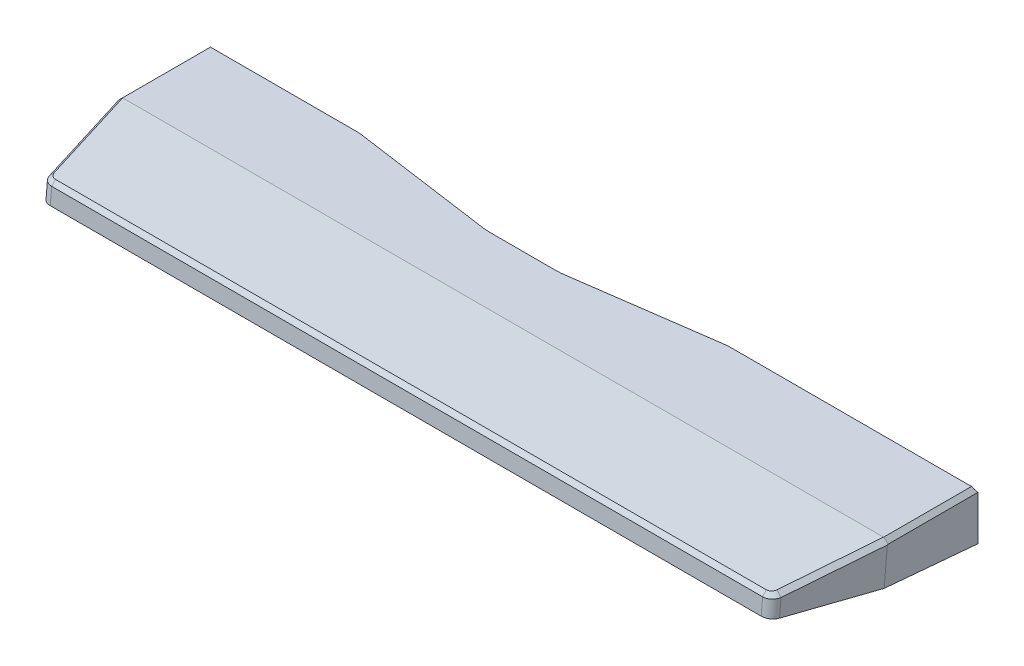
ISO-10303-21;
HEADER;
FILE_DESCRIPTION(('STEP AP214'),'2;1');
FILE_NAME('part.step','',(''),(''),'','','');
FILE_SCHEMA(('AUTOMOTIVE_DESIGN { 1 0 10303 214 1 1 1 1 }'));
ENDSEC;
DATA;
#1=APPLICATION_CONTEXT('core data for automotive mechanical design processes');
#2=APPLICATION_PROTOCOL_DEFINITION('international standard','automotive_design',2000,#1);
#3=PRODUCT_CONTEXT('',#1,'mechanical');
#4=PRODUCT('Part','Part','',(#3));
#5=PRODUCT_RELATED_PRODUCT_CATEGORY('part','',(#4));
#6=PRODUCT_DEFINITION_FORMATION('','',#4);
#7=PRODUCT_DEFINITION_CONTEXT('part definition',#1,'design');
#8=PRODUCT_DEFINITION('design','',#6,#7);
#9=PRODUCT_DEFINITION_SHAPE('','',#8);
#10=(LENGTH_UNIT() NAMED_UNIT(*) SI_UNIT(.MILLI.,.METRE.));
#11=(NAMED_UNIT(*) PLANE_ANGLE_UNIT() SI_UNIT($,.RADIAN.));
#12=(NAMED_UNIT(*) SI_UNIT($,.STERADIAN.) SOLID_ANGLE_UNIT());
#13=UNCERTAINTY_MEASURE_WITH_UNIT(LENGTH_MEASURE(1.E-05),#10,'distance_accuracy_value','');
#14=(GEOMETRIC_REPRESENTATION_CONTEXT(3) GLOBAL_UNCERTAINTY_ASSIGNED_CONTEXT((#13)) GLOBAL_UNIT_ASSIGNED_CONTEXT((#10,
#11,#12)) REPRESENTATION_CONTEXT('',''));
#15=CARTESIAN_POINT('',(0.,0.,0.));
#16=DIRECTION('',(0.,0.,1.));
#17=DIRECTION('',(1.,0.,0.));
#18=AXIS2_PLACEMENT_3D('',#15,#16,#17);
#19=CARTESIAN_POINT('',(348.213934060173,-392.518773560111,105.931813114433));
#20=DIRECTION('',(1.,0.,0.));
#21=DIRECTION('',(0.,0.,-1.));
#22=AXIS2_PLACEMENT_3D('',#19,#20,#21);
#23=PLANE('',#22);
#24=DIRECTION('',(0.,1.,0.));
#25=VECTOR('',#24,1.);
#26=CARTESIAN_POINT('',(348.213934060173,-392.518773560111,17.3508636292026));
#27=LINE('',#26,#25);
#28=CARTESIAN_POINT('',(348.213934060173,-16.3382244657723,17.3508636292026));
#29=VERTEX_POINT('',#28);
#30=CARTESIAN_POINT('',(348.213934060173,5.00000000000006,17.3508636292026));
#31=VERTEX_POINT('',#30);
#32=EDGE_CURVE('E273',#29,#31,#27,.T.);
#33=ORIENTED_EDGE('',*,*,#32,.T.);
#34=DIRECTION('',(0.,0.,1.));
#35=VECTOR('',#34,1.);
#36=CARTESIAN_POINT('',(348.213934060173,5.00000000000006,105.931813114433));
#37=LINE('',#36,#35);
#38=CARTESIAN_POINT('',(348.213934060173,5.00000000000006,60.4095629339724));
#39=VERTEX_POINT('',#38);
#40=EDGE_CURVE('E566',#31,#39,#37,.T.);
#41=ORIENTED_EDGE('',*,*,#40,.T.);
#42=DIRECTION('',(0.,-0.331657517635309,0.943399857428432));
#43=VECTOR('',#42,1.);
#44=CARTESIAN_POINT('',(348.213934060173,-52.9690159169842,225.302437189531));
#45=LINE('',#44,#43);
#46=CARTESIAN_POINT('',(348.213934060173,4.86005218566501,60.8076445123202));
#47=VERTEX_POINT('',#46);
#48=EDGE_CURVE('E567',#39,#47,#45,.T.);
#49=ORIENTED_EDGE('',*,*,#48,.T.);
#50=DIRECTION('',(0.,-0.996194698091746,0.0871557427476516));
#51=VECTOR('',#50,1.);
#52=CARTESIAN_POINT('',(348.213934060173,10.7568400959438,60.2917424189542));
#53=LINE('',#52,#51);
#54=CARTESIAN_POINT('',(348.213934060173,-12.4041043346582,62.3180624931856));
#55=VERTEX_POINT('',#54);
#56=EDGE_CURVE('E222',#47,#55,#53,.T.);
#57=ORIENTED_EDGE('',*,*,#56,.T.);
#58=DIRECTION('',(0.,0.0871557427476516,0.996194698091746));
#59=VECTOR('',#58,1.);
#60=CARTESIAN_POINT('',(348.213934060173,-11.5047781456363,72.5974078709506));
#61=LINE('',#60,#59);
#62=EDGE_CURVE('E228',#29,#55,#61,.T.);
#63=ORIENTED_EDGE('',*,*,#62,.F.);
#64=EDGE_LOOP('',(#33,#41,#49,#57,#63));
#65=FACE_BOUND('',#64,.T.);
#66=ADVANCED_FACE('F35',(#65),#23,.T.);
#67=CARTESIAN_POINT('',(345.213934060173,7.,13.9967616629529));
#68=DIRECTION('',(0.,1.,0.));
#69=DIRECTION('',(0.,0.,1.));
#70=AXIS2_PLACEMENT_3D('',#67,#68,#69);
#71=PLANE('',#70);
#72=CARTESIAN_POINT('',(-17.6293956239181,7.,13.996761662953));
#73=DIRECTION('',(0.,-1.,0.));
#74=DIRECTION('',(0.,0.,1.));
#75=AXIS2_PLACEMENT_3D('',#72,#73,#74);
#76=CIRCLE('',#75,4.5);
#77=CARTESIAN_POINT('',(-17.6293956239181,7.,18.496761662953));
#78=VERTEX_POINT('',#77);
#79=CARTESIAN_POINT('',(-18.6293956239181,7.,18.384243856649));
#80=VERTEX_POINT('',#79);
#81=EDGE_CURVE('E269',#78,#80,#76,.T.);
#82=ORIENTED_EDGE('',*,*,#81,.T.);
#83=DIRECTION('',(0.,0.,1.));
#84=VECTOR('',#83,1.);
#85=CARTESIAN_POINT('',(-18.6293956239181,7.,13.9967616629529));
#86=LINE('',#85,#84);
#87=CARTESIAN_POINT('',(-18.6293956239181,7.,60.4870163306573));
#88=VERTEX_POINT('',#87);
#89=EDGE_CURVE('E590',#80,#88,#86,.T.);
#90=ORIENTED_EDGE('',*,*,#89,.T.);
#91=DIRECTION('',(-0.327684023558453,0.,-0.944787373277471));
#92=VECTOR('',#91,1.);
#93=CARTESIAN_POINT('',(6.04594556714266,6.99999999999999,131.63162245293));
#94=LINE('',#93,#92);
#95=CARTESIAN_POINT('',(-18.5831255887939,7.,60.6204233380291));
#96=VERTEX_POINT('',#95);
#97=EDGE_CURVE('E588',#88,#96,#94,.F.);
#98=ORIENTED_EDGE('',*,*,#97,.T.);
#99=DIRECTION('',(1.,0.,0.));
#100=VECTOR('',#99,1.);
#101=CARTESIAN_POINT('',(-20.6293956239181,7.,60.6204233380291));
#102=LINE('',#101,#100);
#103=CARTESIAN_POINT('',(346.167664025048,7.,60.6204233380289));
#104=VERTEX_POINT('',#103);
#105=EDGE_CURVE('E626',#96,#104,#102,.T.);
#106=ORIENTED_EDGE('',*,*,#105,.T.);
#107=DIRECTION('',(0.327684023558458,0.,-0.944787373277469));
#108=VECTOR('',#107,1.);
#109=CARTESIAN_POINT('',(360.499555513162,7.,19.2983290652897));
#110=LINE('',#109,#108);
#111=CARTESIAN_POINT('',(346.213934060173,7.,60.4870163306568));
#112=VERTEX_POINT('',#111);
#113=EDGE_CURVE('E579',#104,#112,#110,.T.);
#114=ORIENTED_EDGE('',*,*,#113,.T.);
#115=DIRECTION('',(0.,0.,-1.));
#116=VECTOR('',#115,1.);
#117=CARTESIAN_POINT('',(346.213934060173,7.,13.9967616629529));
#118=LINE('',#117,#116);
#119=CARTESIAN_POINT('',(346.213934060173,7.,18.384243856649));
#120=VERTEX_POINT('',#119);
#121=EDGE_CURVE('E564',#112,#120,#118,.T.);
#122=ORIENTED_EDGE('',*,*,#121,.T.);
#123=CARTESIAN_POINT('',(345.213934060173,7.,13.9967616629529));
#124=DIRECTION('',(0.,-1.,0.));
#125=DIRECTION('',(0.,0.,1.));
#126=AXIS2_PLACEMENT_3D('',#123,#124,#125);
#127=CIRCLE('',#126,4.5);
#128=CARTESIAN_POINT('',(345.213934060173,7.,18.4967616629529));
#129=VERTEX_POINT('',#128);
#130=EDGE_CURVE('E240',#120,#129,#127,.T.);
#131=ORIENTED_EDGE('',*,*,#130,.T.);
#132=DIRECTION('',(-1.,0.,0.));
#133=VECTOR('',#132,1.);
#134=CARTESIAN_POINT('',(345.213934060173,7.,18.4967616629529));
#135=LINE('',#134,#133);
#136=CARTESIAN_POINT('',(231.363868361844,7.,18.4967616629529));
#137=VERTEX_POINT('',#136);
#138=EDGE_CURVE('E242',#129,#137,#135,.T.);
#139=ORIENTED_EDGE('',*,*,#138,.T.);
#140=CARTESIAN_POINT('',(231.363868361844,7.,46.996761662953));
#141=DIRECTION('',(0.,1.,0.));
#142=DIRECTION('',(0.,0.,1.));
#143=AXIS2_PLACEMENT_3D('',#140,#141,#142);
#144=CIRCLE('',#143,28.5);
#145=CARTESIAN_POINT('',(227.397434984482,7.,18.7741217038182));
#146=VERTEX_POINT('',#145);
#147=EDGE_CURVE('E245',#137,#146,#144,.T.);
#148=ORIENTED_EDGE('',*,*,#147,.T.);
#149=DIRECTION('',(-0.990268068741571,0.,0.139173100960059));
#150=VECTOR('',#149,1.);
#151=CARTESIAN_POINT('',(174.579364027522,7.,26.1972174834791));
#152=LINE('',#151,#150);
#153=CARTESIAN_POINT('',(160.860648037282,7.,28.1252572797925));
#154=VERTEX_POINT('',#153);
#155=EDGE_CURVE('E248',#146,#154,#152,.T.);
#156=ORIENTED_EDGE('',*,*,#155,.T.);
#157=CARTESIAN_POINT('',(156.47669535704,7.,-3.06818688556698));
#158=DIRECTION('',(0.,-1.,0.));
#159=DIRECTION('',(0.,0.,1.));
#160=AXIS2_PLACEMENT_3D('',#157,#158,#159);
#161=CIRCLE('',#160,31.5);
#162=CARTESIAN_POINT('',(156.476695357039,7.,28.431813114433));
#163=VERTEX_POINT('',#162);
#164=EDGE_CURVE('E251',#154,#163,#161,.T.);
#165=ORIENTED_EDGE('',*,*,#164,.T.);
#166=DIRECTION('',(-1.,0.,0.));
#167=VECTOR('',#166,1.);
#168=CARTESIAN_POINT('',(156.476695357039,7.,28.431813114433));
#169=LINE('',#168,#167);
#170=CARTESIAN_POINT('',(125.67230407365,7.,28.431813114433));
#171=VERTEX_POINT('',#170);
#172=EDGE_CURVE('E254',#163,#171,#169,.T.);
#173=ORIENTED_EDGE('',*,*,#172,.T.);
#174=CARTESIAN_POINT('',(125.67230407365,7.,-3.06818688556699));
#175=DIRECTION('',(0.,-1.,0.));
#176=DIRECTION('',(0.,0.,1.));
#177=AXIS2_PLACEMENT_3D('',#174,#175,#176);
#178=CIRCLE('',#177,31.5);
#179=CARTESIAN_POINT('',(121.288351393408,7.,28.1252572797925));
#180=VERTEX_POINT('',#179);
#181=EDGE_CURVE('E257',#171,#180,#178,.T.);
#182=ORIENTED_EDGE('',*,*,#181,.T.);
#183=DIRECTION('',(-0.990268068741572,0.,-0.139173100960056));
#184=VECTOR('',#183,1.);
#185=CARTESIAN_POINT('',(121.288351393408,7.,28.1252572797925));
#186=LINE('',#185,#184);
#187=CARTESIAN_POINT('',(54.7515644462058,7.,18.7741217038182));
#188=VERTEX_POINT('',#187);
#189=EDGE_CURVE('E260',#180,#188,#186,.T.);
#190=ORIENTED_EDGE('',*,*,#189,.T.);
#191=CARTESIAN_POINT('',(50.7851310688442,7.,46.996761662953));
#192=DIRECTION('',(0.,1.,0.));
#193=DIRECTION('',(0.,0.,1.));
#194=AXIS2_PLACEMENT_3D('',#191,#192,#193);
#195=CIRCLE('',#194,28.5);
#196=CARTESIAN_POINT('',(50.7851310688441,7.,18.496761662953));
#197=VERTEX_POINT('',#196);
#198=EDGE_CURVE('E263',#188,#197,#195,.T.);
#199=ORIENTED_EDGE('',*,*,#198,.T.);
#200=DIRECTION('',(-1.,0.,0.));
#201=VECTOR('',#200,1.);
#202=CARTESIAN_POINT('',(50.7851310688441,7.,18.496761662953));
#203=LINE('',#202,#201);
#204=EDGE_CURVE('E266',#197,#78,#203,.T.);
#205=ORIENTED_EDGE('',*,*,#204,.T.);
#206=EDGE_LOOP('',(#82,#90,#98,#106,#114,#122,#131,#139,#148,#156,#165,#173,#182,#190,#199,#205));
#207=FACE_BOUND('',#206,.T.);
#208=ADVANCED_FACE('F493',(#207),#71,.T.);
#209=CARTESIAN_POINT('',(0.,-17.7205902201384,1.55035075525035));
#210=DIRECTION('',(0.,0.996194698091746,-0.0871557427476516));
#211=DIRECTION('',(0.,0.0871557427476516,0.996194698091746));
#212=AXIS2_PLACEMENT_3D('',#209,#210,#211);
#213=PLANE('',#212);
#214=DIRECTION('',(-0.216293898799249,0.085092618150326,0.9726130760372));
#215=VECTOR('',#214,1.);
#216=CARTESIAN_POINT('',(344.804994124381,-11.0629864119425,77.6471104939983));
#217=LINE('',#216,#215);
#218=CARTESIAN_POINT('',(339.082037792006,-8.81150664027434,103.381642042776));
#219=VERTEX_POINT('',#218);
#220=EDGE_CURVE('E625',#55,#219,#217,.T.);
#221=ORIENTED_EDGE('',*,*,#220,.T.);
#222=CARTESIAN_POINT('',(334.200396292105,-8.9057629172825,102.304287866709));
#223=DIRECTION('',(0.,0.996194698091746,-0.0871557427476516));
#224=DIRECTION('',(0.,0.0871557427476516,0.996194698091746));
#225=AXIS2_PLACEMENT_3D('',#222,#223,#224);
#226=CIRCLE('',#225,5.);
#227=CARTESIAN_POINT('',(334.200396292105,-8.46998420354422,107.285261357168));
#228=VERTEX_POINT('',#227);
#229=EDGE_CURVE('E580',#219,#228,#226,.F.);
#230=ORIENTED_EDGE('',*,*,#229,.T.);
#231=DIRECTION('',(1.,0.,0.));
#232=VECTOR('',#231,1.);
#233=CARTESIAN_POINT('',(-36.2764368442133,-8.46998420354422,107.285261357168));
#234=LINE('',#233,#232);
#235=CARTESIAN_POINT('',(-6.61585785585053,-8.46998420354422,107.285261357168));
#236=VERTEX_POINT('',#235);
#237=EDGE_CURVE('E212',#236,#228,#234,.T.);
#238=ORIENTED_EDGE('',*,*,#237,.F.);
#239=CARTESIAN_POINT('',(-6.61585785585053,-8.90576291728247,102.30428786671));
#240=DIRECTION('',(0.,0.996194698091746,-0.0871557427476516));
#241=DIRECTION('',(0.,0.0871557427476516,0.996194698091746));
#242=AXIS2_PLACEMENT_3D('',#239,#240,#241);
#243=CIRCLE('',#242,5.);
#244=CARTESIAN_POINT('',(-11.4974993557515,-8.81150664027432,103.381642042777));
#245=VERTEX_POINT('',#244);
#246=EDGE_CURVE('E221',#236,#245,#243,.F.);
#247=ORIENTED_EDGE('',*,*,#246,.T.);
#248=DIRECTION('',(0.216293898799249,0.085092618150326,0.972613076037199));
#249=VECTOR('',#248,1.);
#250=CARTESIAN_POINT('',(-32.5458597444949,-17.0921844735041,8.73306130663646));
#251=LINE('',#250,#249);
#252=CARTESIAN_POINT('',(-20.6293956239181,-12.4041043346582,62.3180624931855));
#253=VERTEX_POINT('',#252);
#254=EDGE_CURVE('E205',#253,#245,#251,.T.);
#255=ORIENTED_EDGE('',*,*,#254,.F.);
#256=DIRECTION('',(0.,-0.0871557427476516,-0.996194698091746));
#257=VECTOR('',#256,1.);
#258=CARTESIAN_POINT('',(-20.6293956239181,-11.5047781456363,72.5974078709506));
#259=LINE('',#258,#257);
#260=CARTESIAN_POINT('',(-20.6293956239181,-16.3382244657723,17.3508636292026));
#261=VERTEX_POINT('',#260);
#262=EDGE_CURVE('E217',#253,#261,#259,.T.);
#263=ORIENTED_EDGE('',*,*,#262,.T.);
#264=CARTESIAN_POINT('',(-17.6293956239181,-16.6316703641291,13.996761662953));
#265=DIRECTION('',(0.,0.996194698091746,-0.0871557427476516));
#266=DIRECTION('',(0.,0.0871557427476516,0.996194698091746));
#267=AXIS2_PLACEMENT_3D('',#264,#265,#266);
#268=ELLIPSE('',#267,4.51718926894506,4.5);
#269=CARTESIAN_POINT('',(-17.6293956239181,-16.2379713782624,18.4967616629529));
#270=VERTEX_POINT('',#269);
#271=EDGE_CURVE('E229',#261,#270,#268,.T.);
#272=ORIENTED_EDGE('',*,*,#271,.T.);
#273=DIRECTION('',(1.,0.,0.));
#274=VECTOR('',#273,1.);
#275=CARTESIAN_POINT('',(50.7851310688441,-16.2379713782624,18.496761662953));
#276=LINE('',#275,#274);
#277=CARTESIAN_POINT('',(50.7851310688441,-16.2379713782625,18.496761662953));
#278=VERTEX_POINT('',#277);
#279=EDGE_CURVE('E234',#270,#278,#276,.T.);
#280=ORIENTED_EDGE('',*,*,#279,.T.);
#281=CARTESIAN_POINT('',(50.7851310688442,-13.7445444677738,46.996761662953));
#282=DIRECTION('',(0.,0.996194698091746,-0.0871557427476516));
#283=DIRECTION('',(0.,0.0871557427476516,0.996194698091746));
#284=AXIS2_PLACEMENT_3D('',#281,#282,#283);
#285=ELLIPSE('',#284,28.6088653699854,28.5);
#286=CARTESIAN_POINT('',(54.7515644462058,-16.2137055189717,18.7741217038182));
#287=VERTEX_POINT('',#286);
#288=EDGE_CURVE('E608',#278,#287,#285,.F.);
#289=ORIENTED_EDGE('',*,*,#288,.T.);
#290=DIRECTION('',(0.99019466999131,0.0121751661105521,0.139162785438428));
#291=VECTOR('',#290,1.);
#292=CARTESIAN_POINT('',(116.741835494738,-15.4514898959966,27.4862861404058));
#293=LINE('',#292,#291);
#294=CARTESIAN_POINT('',(121.288351393408,-15.39558716498,28.1252572797925));
#295=VERTEX_POINT('',#294);
#296=EDGE_CURVE('E609',#287,#295,#293,.T.);
#297=ORIENTED_EDGE('',*,*,#296,.T.);
#298=CARTESIAN_POINT('',(125.67230407365,-18.1246599057777,-3.06818688556699));
#299=DIRECTION('',(0.,0.996194698091746,-0.0871557427476516));
#300=DIRECTION('',(0.,0.0871557427476516,0.996194698091746));
#301=AXIS2_PLACEMENT_3D('',#298,#299,#300);
#302=ELLIPSE('',#301,31.6203248826154,31.5);
#303=CARTESIAN_POINT('',(125.67230407365,-15.3687670047112,28.431813114433));
#304=VERTEX_POINT('',#303);
#305=EDGE_CURVE('E613',#295,#304,#302,.T.);
#306=ORIENTED_EDGE('',*,*,#305,.T.);
#307=DIRECTION('',(1.,0.,0.));
#308=VECTOR('',#307,1.);
#309=CARTESIAN_POINT('',(156.476695357039,-15.3687670047112,28.431813114433));
#310=LINE('',#309,#308);
#311=CARTESIAN_POINT('',(156.476695357039,-15.3687670047112,28.431813114433));
#312=VERTEX_POINT('',#311);
#313=EDGE_CURVE('E615',#304,#312,#310,.T.);
#314=ORIENTED_EDGE('',*,*,#313,.T.);
#315=CARTESIAN_POINT('',(156.47669535704,-18.1246599057777,-3.06818688556698));
#316=DIRECTION('',(0.,0.996194698091746,-0.0871557427476516));
#317=DIRECTION('',(0.,0.0871557427476516,0.996194698091746));
#318=AXIS2_PLACEMENT_3D('',#315,#316,#317);
#319=ELLIPSE('',#318,31.6203248826154,31.5);
#320=CARTESIAN_POINT('',(160.860648037282,-15.39558716498,28.1252572797925));
#321=VERTEX_POINT('',#320);
#322=EDGE_CURVE('E617',#312,#321,#319,.T.);
#323=ORIENTED_EDGE('',*,*,#322,.T.);
#324=DIRECTION('',(0.990194669991309,-0.0121751661105524,-0.139162785438432));
#325=VECTOR('',#324,1.);
#326=CARTESIAN_POINT('',(179.123846336857,-15.6201465165358,25.558532146435));
#327=LINE('',#326,#325);
#328=CARTESIAN_POINT('',(227.397434984482,-16.2137055189717,18.7741217038181));
#329=VERTEX_POINT('',#328);
#330=EDGE_CURVE('E619',#321,#329,#327,.T.);
#331=ORIENTED_EDGE('',*,*,#330,.T.);
#332=CARTESIAN_POINT('',(231.363868361844,-13.7445444677738,46.996761662953));
#333=DIRECTION('',(0.,0.996194698091746,-0.0871557427476516));
#334=DIRECTION('',(0.,0.0871557427476516,0.996194698091746));
#335=AXIS2_PLACEMENT_3D('',#332,#333,#334);
#336=ELLIPSE('',#335,28.6088653699854,28.5);
#337=CARTESIAN_POINT('',(231.363868361844,-16.2379713782624,18.4967616629529));
#338=VERTEX_POINT('',#337);
#339=EDGE_CURVE('E276',#329,#338,#336,.F.);
#340=ORIENTED_EDGE('',*,*,#339,.T.);
#341=DIRECTION('',(1.,0.,0.));
#342=VECTOR('',#341,1.);
#343=CARTESIAN_POINT('',(345.213934060173,-16.2379713782624,18.4967616629529));
#344=LINE('',#343,#342);
#345=CARTESIAN_POINT('',(345.213934060173,-16.2379713782624,18.4967616629529));
#346=VERTEX_POINT('',#345);
#347=EDGE_CURVE('E239',#338,#346,#344,.T.);
#348=ORIENTED_EDGE('',*,*,#347,.T.);
#349=CARTESIAN_POINT('',(345.213934060173,-16.6316703641291,13.9967616629529));
#350=DIRECTION('',(0.,0.996194698091746,-0.0871557427476516));
#351=DIRECTION('',(0.,0.0871557427476516,0.996194698091746));
#352=AXIS2_PLACEMENT_3D('',#349,#350,#351);
#353=ELLIPSE('',#352,4.51718926894506,4.5);
#354=EDGE_CURVE('E232',#346,#29,#353,.T.);
#355=ORIENTED_EDGE('',*,*,#354,.T.);
#356=ORIENTED_EDGE('',*,*,#62,.T.);
#357=EDGE_LOOP('',(#221,#230,#238,#247,#255,#263,#272,#280,#289,#297,#306,#314,#323,#331,#340,
#348,#355,#356));
#358=FACE_BOUND('',#357,.T.);
#359=ADVANCED_FACE('F216',(#358),#213,.F.);
#360=CARTESIAN_POINT('',(-36.2764368442133,6.99999999999999,105.931813114433));
#361=DIRECTION('',(0.,0.0871557427476512,0.996194698091746));
#362=DIRECTION('',(0.,-0.996194698091746,0.0871557427476513));
#363=AXIS2_PLACEMENT_3D('',#360,#361,#362);
#364=PLANE('',#363);
#365=DIRECTION('',(0.,0.996194698091746,-0.0871557427476513));
#366=VECTOR('',#365,1.);
#367=CARTESIAN_POINT('',(334.200396292105,7.,105.931813114433));
#368=LINE('',#367,#366);
#369=CARTESIAN_POINT('',(334.200396292105,-0.755738745400526,106.610352331924));
#370=VERTEX_POINT('',#369);
#371=EDGE_CURVE('E307',#228,#370,#368,.T.);
#372=ORIENTED_EDGE('',*,*,#371,.T.);
#373=DIRECTION('',(-1.,0.,0.));
#374=VECTOR('',#373,1.);
#375=CARTESIAN_POINT('',(-6.61585785585053,-0.755738745400323,106.610352331924));
#376=LINE('',#375,#374);
#377=CARTESIAN_POINT('',(-6.61585785585053,-0.755738745400308,106.610352331924));
#378=VERTEX_POINT('',#377);
#379=EDGE_CURVE('E680',#370,#378,#376,.T.);
#380=ORIENTED_EDGE('',*,*,#379,.T.);
#381=DIRECTION('',(0.,0.996194698091746,-0.0871557427476513));
#382=VECTOR('',#381,1.);
#383=CARTESIAN_POINT('',(-6.61585785585053,-8.46998420354422,107.285261357168));
#384=LINE('',#383,#382);
#385=EDGE_CURVE('E299',#378,#236,#384,.F.);
#386=ORIENTED_EDGE('',*,*,#385,.T.);
#387=ORIENTED_EDGE('',*,*,#237,.T.);
#388=EDGE_LOOP('',(#372,#380,#386,#387));
#389=FACE_BOUND('',#388,.T.);
#390=ADVANCED_FACE('F547',(#389),#364,.T.);
#391=CARTESIAN_POINT('',(345.213934060173,-392.518773560111,13.9967616629529));
#392=DIRECTION('',(0.,1.,0.));
#393=DIRECTION('',(0.,0.,1.));
#394=AXIS2_PLACEMENT_3D('',#391,#392,#393);
#395=CYLINDRICAL_SURFACE('',#394,4.5);
#396=ORIENTED_EDGE('',*,*,#130,.F.);
#397=CARTESIAN_POINT('',(345.213934060173,7.99999999999995,13.9967616629529));
#398=DIRECTION('',(-0.707106781186535,-0.70710678118656,0.));
#399=DIRECTION('',(-0.70710678118656,0.707106781186535,0.));
#400=AXIS2_PLACEMENT_3D('',#397,#398,#399);
#401=ELLIPSE('',#400,6.36396103067882,4.5);
#402=EDGE_CURVE('E557',#120,#31,#401,.F.);
#403=ORIENTED_EDGE('',*,*,#402,.T.);
#404=ORIENTED_EDGE('',*,*,#32,.F.);
#405=ORIENTED_EDGE('',*,*,#354,.F.);
#406=DIRECTION('',(0.,1.,0.));
#407=VECTOR('',#406,1.);
#408=CARTESIAN_POINT('',(345.213934060173,-392.518773560111,18.4967616629529));
#409=LINE('',#408,#407);
#410=EDGE_CURVE('E272',#346,#129,#409,.T.);
#411=ORIENTED_EDGE('',*,*,#410,.T.);
#412=EDGE_LOOP('',(#396,#403,#404,#405,#411));
#413=FACE_BOUND('',#412,.T.);
#414=ADVANCED_FACE('F506',(#413),#395,.F.);
#415=CARTESIAN_POINT('',(-20.6293956239181,-392.518773560111,105.931813114433));
#416=DIRECTION('',(-1.,0.,0.));
#417=DIRECTION('',(0.,0.,1.));
#418=AXIS2_PLACEMENT_3D('',#415,#416,#417);
#419=PLANE('',#418);
#420=DIRECTION('',(0.,-0.331657517635315,0.943399857428429));
#421=VECTOR('',#420,1.);
#422=CARTESIAN_POINT('',(-20.6293956239181,-52.9690159169862,225.302437189533));
#423=LINE('',#422,#421);
#424=CARTESIAN_POINT('',(-20.6293956239181,4.86005218566504,60.8076445123202));
#425=VERTEX_POINT('',#424);
#426=CARTESIAN_POINT('',(-20.6293956239181,5.00000000000006,60.4095629339727));
#427=VERTEX_POINT('',#426);
#428=EDGE_CURVE('E593',#425,#427,#423,.F.);
#429=ORIENTED_EDGE('',*,*,#428,.T.);
#430=DIRECTION('',(0.,0.,-1.));
#431=VECTOR('',#430,1.);
#432=CARTESIAN_POINT('',(-20.6293956239181,5.00000000000006,105.931813114433));
#433=LINE('',#432,#431);
#434=CARTESIAN_POINT('',(-20.6293956239181,5.00000000000006,17.3508636292026));
#435=VERTEX_POINT('',#434);
#436=EDGE_CURVE('E571',#427,#435,#433,.T.);
#437=ORIENTED_EDGE('',*,*,#436,.T.);
#438=DIRECTION('',(0.,1.,0.));
#439=VECTOR('',#438,1.);
#440=CARTESIAN_POINT('',(-20.6293956239181,-392.518773560111,17.3508636292026));
#441=LINE('',#440,#439);
#442=EDGE_CURVE('E227',#261,#435,#441,.T.);
#443=ORIENTED_EDGE('',*,*,#442,.F.);
#444=ORIENTED_EDGE('',*,*,#262,.F.);
#445=DIRECTION('',(0.,-0.996194698091746,0.0871557427476516));
#446=VECTOR('',#445,1.);
#447=CARTESIAN_POINT('',(-20.6293956239181,10.7568400959438,60.2917424189541));
#448=LINE('',#447,#446);
#449=EDGE_CURVE('E201',#425,#253,#448,.T.);
#450=ORIENTED_EDGE('',*,*,#449,.F.);
#451=EDGE_LOOP('',(#429,#437,#443,#444,#450));
#452=FACE_BOUND('',#451,.T.);
#453=ADVANCED_FACE('F225',(#452),#419,.T.);
#454=CARTESIAN_POINT('',(-17.6293956239181,-392.518773560111,13.9967616629529));
#455=DIRECTION('',(0.,1.,0.));
#456=DIRECTION('',(0.,0.,1.));
#457=AXIS2_PLACEMENT_3D('',#454,#455,#456);
#458=CYLINDRICAL_SURFACE('',#457,4.5);
#459=ORIENTED_EDGE('',*,*,#442,.T.);
#460=CARTESIAN_POINT('',(-17.6293956239181,7.9999999999999,13.996761662953));
#461=DIRECTION('',(0.707106781186536,-0.707106781186559,0.));
#462=DIRECTION('',(0.707106781186559,0.707106781186536,0.));
#463=AXIS2_PLACEMENT_3D('',#460,#461,#462);
#464=ELLIPSE('',#463,6.36396103067882,4.5);
#465=EDGE_CURVE('E568',#435,#80,#464,.F.);
#466=ORIENTED_EDGE('',*,*,#465,.T.);
#467=ORIENTED_EDGE('',*,*,#81,.F.);
#468=DIRECTION('',(0.,1.,0.));
#469=VECTOR('',#468,1.);
#470=CARTESIAN_POINT('',(-17.6293956239181,-392.518773560111,18.4967616629529));
#471=LINE('',#470,#469);
#472=EDGE_CURVE('E278',#270,#78,#471,.T.);
#473=ORIENTED_EDGE('',*,*,#472,.F.);
#474=ORIENTED_EDGE('',*,*,#271,.F.);
#475=EDGE_LOOP('',(#459,#466,#467,#473,#474));
#476=FACE_BOUND('',#475,.T.);
#477=ADVANCED_FACE('F505',(#476),#458,.F.);
#478=CARTESIAN_POINT('',(50.7851310688441,-392.518773560111,18.4967616629529));
#479=DIRECTION('',(0.,0.,-1.));
#480=DIRECTION('',(0.,1.,0.));
#481=AXIS2_PLACEMENT_3D('',#478,#479,#480);
#482=PLANE('',#481);
#483=ORIENTED_EDGE('',*,*,#279,.F.);
#484=ORIENTED_EDGE('',*,*,#472,.T.);
#485=ORIENTED_EDGE('',*,*,#204,.F.);
#486=DIRECTION('',(0.,1.,0.));
#487=VECTOR('',#486,1.);
#488=CARTESIAN_POINT('',(50.7851310688441,-392.518773560111,18.4967616629529));
#489=LINE('',#488,#487);
#490=EDGE_CURVE('E280',#278,#197,#489,.T.);
#491=ORIENTED_EDGE('',*,*,#490,.F.);
#492=EDGE_LOOP('',(#483,#484,#485,#491));
#493=FACE_BOUND('',#492,.T.);
#494=ADVANCED_FACE('F509',(#493),#482,.T.);
#495=CARTESIAN_POINT('',(50.7851310688442,-392.518773560111,46.9967616629529));
#496=DIRECTION('',(0.,1.,0.));
#497=DIRECTION('',(0.,0.,1.));
#498=AXIS2_PLACEMENT_3D('',#495,#496,#497);
#499=CYLINDRICAL_SURFACE('',#498,28.5);
#500=ORIENTED_EDGE('',*,*,#288,.F.);
#501=ORIENTED_EDGE('',*,*,#490,.T.);
#502=ORIENTED_EDGE('',*,*,#198,.F.);
#503=DIRECTION('',(0.,1.,0.));
#504=VECTOR('',#503,1.);
#505=CARTESIAN_POINT('',(54.7515644462058,-392.518773560111,18.7741217038181));
#506=LINE('',#505,#504);
#507=EDGE_CURVE('E282',#287,#188,#506,.T.);
#508=ORIENTED_EDGE('',*,*,#507,.F.);
#509=EDGE_LOOP('',(#500,#501,#502,#508));
#510=FACE_BOUND('',#509,.T.);
#511=ADVANCED_FACE('F513',(#510),#499,.T.);
#512=CARTESIAN_POINT('',(121.288351393408,-392.518773560111,28.1252572797925));
#513=DIRECTION('',(0.139173100960056,0.,-0.990268068741572));
#514=DIRECTION('',(-0.990268068741572,0.,-0.139173100960056));
#515=AXIS2_PLACEMENT_3D('',#512,#513,#514);
#516=PLANE('',#515);
#517=ORIENTED_EDGE('',*,*,#296,.F.);
#518=ORIENTED_EDGE('',*,*,#507,.T.);
#519=ORIENTED_EDGE('',*,*,#189,.F.);
#520=DIRECTION('',(0.,1.,0.));
#521=VECTOR('',#520,1.);
#522=CARTESIAN_POINT('',(121.288351393408,-392.518773560111,28.1252572797925));
#523=LINE('',#522,#521);
#524=EDGE_CURVE('E284',#295,#180,#523,.T.);
#525=ORIENTED_EDGE('',*,*,#524,.F.);
#526=EDGE_LOOP('',(#517,#518,#519,#525));
#527=FACE_BOUND('',#526,.T.);
#528=ADVANCED_FACE('F517',(#527),#516,.T.);
#529=CARTESIAN_POINT('',(125.67230407365,-392.518773560111,-3.06818688556704));
#530=DIRECTION('',(0.,1.,0.));
#531=DIRECTION('',(0.,0.,1.));
#532=AXIS2_PLACEMENT_3D('',#529,#530,#531);
#533=CYLINDRICAL_SURFACE('',#532,31.5);
#534=ORIENTED_EDGE('',*,*,#305,.F.);
#535=ORIENTED_EDGE('',*,*,#524,.T.);
#536=ORIENTED_EDGE('',*,*,#181,.F.);
#537=DIRECTION('',(0.,1.,0.));
#538=VECTOR('',#537,1.);
#539=CARTESIAN_POINT('',(125.67230407365,-392.518773560111,28.431813114433));
#540=LINE('',#539,#538);
#541=EDGE_CURVE('E286',#304,#171,#540,.T.);
#542=ORIENTED_EDGE('',*,*,#541,.F.);
#543=EDGE_LOOP('',(#534,#535,#536,#542));
#544=FACE_BOUND('',#543,.T.);
#545=ADVANCED_FACE('F521',(#544),#533,.F.);
#546=CARTESIAN_POINT('',(156.476695357039,-392.518773560111,28.431813114433));
#547=DIRECTION('',(0.,0.,-1.));
#548=DIRECTION('',(0.,1.,0.));
#549=AXIS2_PLACEMENT_3D('',#546,#547,#548);
#550=PLANE('',#549);
#551=ORIENTED_EDGE('',*,*,#313,.F.);
#552=ORIENTED_EDGE('',*,*,#541,.T.);
#553=ORIENTED_EDGE('',*,*,#172,.F.);
#554=DIRECTION('',(0.,1.,0.));
#555=VECTOR('',#554,1.);
#556=CARTESIAN_POINT('',(156.476695357039,-392.518773560111,28.431813114433));
#557=LINE('',#556,#555);
#558=EDGE_CURVE('E288',#312,#163,#557,.T.);
#559=ORIENTED_EDGE('',*,*,#558,.F.);
#560=EDGE_LOOP('',(#551,#552,#553,#559));
#561=FACE_BOUND('',#560,.T.);
#562=ADVANCED_FACE('F525',(#561),#550,.T.);
#563=CARTESIAN_POINT('',(156.47669535704,-392.518773560111,-3.06818688556703));
#564=DIRECTION('',(0.,1.,0.));
#565=DIRECTION('',(0.,0.,1.));
#566=AXIS2_PLACEMENT_3D('',#563,#564,#565);
#567=CYLINDRICAL_SURFACE('',#566,31.5);
#568=ORIENTED_EDGE('',*,*,#322,.F.);
#569=ORIENTED_EDGE('',*,*,#558,.T.);
#570=ORIENTED_EDGE('',*,*,#164,.F.);
#571=DIRECTION('',(0.,1.,0.));
#572=VECTOR('',#571,1.);
#573=CARTESIAN_POINT('',(160.860648037282,-392.518773560111,28.1252572797924));
#574=LINE('',#573,#572);
#575=EDGE_CURVE('E290',#321,#154,#574,.T.);
#576=ORIENTED_EDGE('',*,*,#575,.F.);
#577=EDGE_LOOP('',(#568,#569,#570,#576));
#578=FACE_BOUND('',#577,.T.);
#579=ADVANCED_FACE('F529',(#578),#567,.F.);
#580=CARTESIAN_POINT('',(174.579364027522,-392.518773560111,26.1972174834791));
#581=DIRECTION('',(-0.139173100960059,0.,-0.990268068741571));
#582=DIRECTION('',(-0.990268068741571,0.,0.139173100960059));
#583=AXIS2_PLACEMENT_3D('',#580,#581,#582);
#584=PLANE('',#583);
#585=ORIENTED_EDGE('',*,*,#330,.F.);
#586=ORIENTED_EDGE('',*,*,#575,.T.);
#587=ORIENTED_EDGE('',*,*,#155,.F.);
#588=DIRECTION('',(0.,1.,0.));
#589=VECTOR('',#588,1.);
#590=CARTESIAN_POINT('',(227.397434984482,-392.518773560111,18.7741217038181));
#591=LINE('',#590,#589);
#592=EDGE_CURVE('E292',#329,#146,#591,.T.);
#593=ORIENTED_EDGE('',*,*,#592,.F.);
#594=EDGE_LOOP('',(#585,#586,#587,#593));
#595=FACE_BOUND('',#594,.T.);
#596=ADVANCED_FACE('F533',(#595),#584,.T.);
#597=CARTESIAN_POINT('',(231.363868361844,-392.518773560111,46.9967616629529));
#598=DIRECTION('',(0.,1.,0.));
#599=DIRECTION('',(0.,0.,1.));
#600=AXIS2_PLACEMENT_3D('',#597,#598,#599);
#601=CYLINDRICAL_SURFACE('',#600,28.5);
#602=ORIENTED_EDGE('',*,*,#339,.F.);
#603=ORIENTED_EDGE('',*,*,#592,.T.);
#604=ORIENTED_EDGE('',*,*,#147,.F.);
#605=DIRECTION('',(0.,1.,0.));
#606=VECTOR('',#605,1.);
#607=CARTESIAN_POINT('',(231.363868361844,-392.518773560111,18.4967616629529));
#608=LINE('',#607,#606);
#609=EDGE_CURVE('E294',#338,#137,#608,.T.);
#610=ORIENTED_EDGE('',*,*,#609,.F.);
#611=EDGE_LOOP('',(#602,#603,#604,#610));
#612=FACE_BOUND('',#611,.T.);
#613=ADVANCED_FACE('F537',(#612),#601,.T.);
#614=CARTESIAN_POINT('',(345.213934060173,-392.518773560111,18.4967616629529));
#615=DIRECTION('',(0.,0.,-1.));
#616=DIRECTION('',(0.,1.,0.));
#617=AXIS2_PLACEMENT_3D('',#614,#615,#616);
#618=PLANE('',#617);
#619=ORIENTED_EDGE('',*,*,#347,.F.);
#620=ORIENTED_EDGE('',*,*,#609,.T.);
#621=ORIENTED_EDGE('',*,*,#138,.F.);
#622=ORIENTED_EDGE('',*,*,#410,.F.);
#623=EDGE_LOOP('',(#619,#620,#621,#622));
#624=FACE_BOUND('',#623,.T.);
#625=ADVANCED_FACE('F541',(#624),#618,.T.);
#626=CARTESIAN_POINT('',(344.804994124381,12.0979580186595,75.6207904197669));
#627=DIRECTION('',(0.976328299980196,0.0188512554016339,0.215470835213404));
#628=DIRECTION('',(0.215509131337735,0.,-0.976501825041845));
#629=AXIS2_PLACEMENT_3D('',#626,#627,#628);
#630=PLANE('',#629);
#631=ORIENTED_EDGE('',*,*,#56,.F.);
#632=DIRECTION('',(-0.211453267917075,-0.1263891746359,0.969181764181542));
#633=VECTOR('',#632,1.);
#634=CARTESIAN_POINT('',(339.177597242397,-0.541118311158686,102.225083670674));
#635=LINE('',#634,#633);
#636=CARTESIAN_POINT('',(339.082037792006,-0.598235801857878,102.663073953947));
#637=VERTEX_POINT('',#636);
#638=EDGE_CURVE('E11',#47,#637,#635,.T.);
#639=ORIENTED_EDGE('',*,*,#638,.T.);
#640=DIRECTION('',(0.,0.996194698091746,-0.0871557427476512));
#641=VECTOR('',#640,1.);
#642=CARTESIAN_POINT('',(339.082037792006,14.3494377903277,101.355321968545));
#643=LINE('',#642,#641);
#644=EDGE_CURVE('E642',#637,#219,#643,.F.);
#645=ORIENTED_EDGE('',*,*,#644,.T.);
#646=ORIENTED_EDGE('',*,*,#220,.F.);
#647=EDGE_LOOP('',(#631,#639,#645,#646));
#648=FACE_BOUND('',#647,.T.);
#649=ADVANCED_FACE('F544',(#648),#630,.T.);
#650=CARTESIAN_POINT('',(-32.5458597444949,6.0687599570979,6.70674123240505));
#651=DIRECTION('',(0.976328299980196,-0.0188512554016339,-0.215470835213404));
#652=DIRECTION('',(-0.215509131337735,0.,-0.976501825041845));
#653=AXIS2_PLACEMENT_3D('',#650,#651,#652);
#654=PLANE('',#653);
#655=DIRECTION('',(0.,0.996194698091746,-0.0871557427476513));
#656=VECTOR('',#655,1.);
#657=CARTESIAN_POINT('',(-11.4974993557515,0.681309374719429,102.551128256527));
#658=LINE('',#657,#656);
#659=CARTESIAN_POINT('',(-11.4974993557515,-0.598235801858154,102.663073953947));
#660=VERTEX_POINT('',#659);
#661=EDGE_CURVE('E576',#245,#660,#658,.T.);
#662=ORIENTED_EDGE('',*,*,#661,.T.);
#663=DIRECTION('',(-0.211453267917074,0.1263891746359,-0.969181764181542));
#664=VECTOR('',#663,1.);
#665=CARTESIAN_POINT('',(-32.2817714922173,11.8248732217682,7.39976714920719));
#666=LINE('',#665,#664);
#667=EDGE_CURVE('E208',#660,#425,#666,.T.);
#668=ORIENTED_EDGE('',*,*,#667,.T.);
#669=ORIENTED_EDGE('',*,*,#449,.T.);
#670=ORIENTED_EDGE('',*,*,#254,.T.);
#671=EDGE_LOOP('',(#662,#668,#669,#670));
#672=FACE_BOUND('',#671,.T.);
#673=ADVANCED_FACE('F204',(#672),#654,.F.);
#674=CARTESIAN_POINT('',(-20.6293956239181,1.0228318114495,106.454747570919));
#675=DIRECTION('',(0.,-0.991603801316731,-0.129313190410758));
#676=DIRECTION('',(0.,0.129313190410758,-0.991603801316731));
#677=AXIS2_PLACEMENT_3D('',#674,#675,#676);
#678=PLANE('',#677);
#679=ORIENTED_EDGE('',*,*,#105,.F.);
#680=DIRECTION('',(0.211453267917075,-0.1263891746359,0.969181764181542));
#681=VECTOR('',#680,1.);
#682=CARTESIAN_POINT('',(-9.12174425117664,1.3447732449048,103.986025329966));
#683=LINE('',#682,#681);
#684=CARTESIAN_POINT('',(-9.44716368749094,1.5392819151722,102.494487334394));
#685=VERTEX_POINT('',#684);
#686=EDGE_CURVE('E672',#96,#685,#683,.T.);
#687=ORIENTED_EDGE('',*,*,#686,.T.);
#688=CARTESIAN_POINT('',(-6.61585785585052,1.238336313345,104.80220862573));
#689=CARTESIAN_POINT('',(-6.94279023786762,1.23832152696159,104.802322011177));
#690=CARTESIAN_POINT('',(-7.26960770845256,1.24572549841019,104.745546625697));
#691=CARTESIAN_POINT('',(-7.73222298345999,1.26726943731828,104.580342661208));
#692=CARTESIAN_POINT('',(-7.88181735193676,1.27618118919022,104.512005262644));
#693=CARTESIAN_POINT('',(-8.16756377055127,1.29721172659639,104.350738181));
#694=CARTESIAN_POINT('',(-8.30370379858729,1.30933010566376,104.257811614802));
#695=CARTESIAN_POINT('',(-8.55864630424061,1.33642849430753,104.050014830086));
#696=CARTESIAN_POINT('',(-8.67744297048331,1.35140788618053,103.935149348262));
#697=CARTESIAN_POINT('',(-8.89430910627991,1.38380112093704,103.686750444643));
#698=CARTESIAN_POINT('',(-8.99237297880331,1.4012134975335,103.55322826668));
#699=CARTESIAN_POINT('',(-9.25128014559333,1.45636173467809,103.130338680438));
#700=CARTESIAN_POINT('',(-9.37655922989775,1.49701208092076,102.818622313909));
#701=CARTESIAN_POINT('',(-9.44716368749094,1.5392819151722,102.494487334394));
#702=B_SPLINE_CURVE_WITH_KNOTS('',3,(#688,#689,#690,#691,#692,#693,#694,#695,#696,#697,#698,
#699,#700,#701),.UNSPECIFIED.,.F.,.F.,(4,2,2,2,2,2,4),(0.,0.338194855214652,0.507292282821979,
0.676389710429305,0.845487138036632,1.01458456564396,1.35277942085861),.UNSPECIFIED.);
#703=CARTESIAN_POINT('',(-6.61585785585052,1.238336313345,104.80220862573));
#704=VERTEX_POINT('',#703);
#705=EDGE_CURVE('E678',#685,#704,#702,.F.);
#706=ORIENTED_EDGE('',*,*,#705,.T.);
#707=DIRECTION('',(1.,0.,0.));
#708=VECTOR('',#707,1.);
#709=CARTESIAN_POINT('',(334.200396292105,1.238336313345,104.802208625729));
#710=LINE('',#709,#708);
#711=CARTESIAN_POINT('',(334.200396292105,1.238336313345,104.802208625729));
#712=VERTEX_POINT('',#711);
#713=EDGE_CURVE('E681',#704,#712,#710,.T.);
#714=ORIENTED_EDGE('',*,*,#713,.T.);
#715=CARTESIAN_POINT('',(337.031702123745,1.5392819151722,102.494487334394));
#716=CARTESIAN_POINT('',(336.961097666152,1.49701208092076,102.818622313909));
#717=CARTESIAN_POINT('',(336.835818581848,1.4563617346781,103.130338680437));
#718=CARTESIAN_POINT('',(336.576911415058,1.4012134975335,103.55322826668));
#719=CARTESIAN_POINT('',(336.478847542534,1.38380112093704,103.686750444643));
#720=CARTESIAN_POINT('',(336.261981406738,1.35140788618053,103.935149348262));
#721=CARTESIAN_POINT('',(336.143184740495,1.33642849430754,104.050014830086));
#722=CARTESIAN_POINT('',(335.888242234842,1.30933010566376,104.257811614802));
#723=CARTESIAN_POINT('',(335.752102206806,1.29721172659639,104.350738181));
#724=CARTESIAN_POINT('',(335.466355788191,1.27618118919023,104.512005262644));
#725=CARTESIAN_POINT('',(335.316761419714,1.26726943731828,104.580342661208));
#726=CARTESIAN_POINT('',(334.854146144707,1.24572549841019,104.745546625697));
#727=CARTESIAN_POINT('',(334.527328674122,1.23832152696159,104.802322011177));
#728=CARTESIAN_POINT('',(334.200396292105,1.238336313345,104.802208625729));
#729=B_SPLINE_CURVE_WITH_KNOTS('',3,(#715,#716,#717,#718,#719,#720,#721,#722,#723,#724,#725,
#726,#727,#728),.UNSPECIFIED.,.F.,.F.,(4,2,2,2,2,2,4),(1.78881323273118,2.12700808794583,
2.29610551555316,2.46520294316049,2.63430037076781,2.80339779837514,3.14159265358979),.UNSPECIFIED.);
#730=CARTESIAN_POINT('',(337.031702123745,1.5392819151722,102.494487334394));
#731=VERTEX_POINT('',#730);
#732=EDGE_CURVE('E682',#712,#731,#729,.F.);
#733=ORIENTED_EDGE('',*,*,#732,.T.);
#734=DIRECTION('',(0.211453267917075,0.1263891746359,-0.969181764181542));
#735=VECTOR('',#734,1.);
#736=CARTESIAN_POINT('',(346.259157842303,7.05468739339428,60.201067609494));
#737=LINE('',#736,#735);
#738=EDGE_CURVE('E684',#731,#104,#737,.T.);
#739=ORIENTED_EDGE('',*,*,#738,.T.);
#740=EDGE_LOOP('',(#679,#687,#706,#714,#733,#739));
#741=FACE_BOUND('',#740,.T.);
#742=ADVANCED_FACE('F649',(#741),#678,.F.);
#743=CARTESIAN_POINT('',(334.200396292105,6.56422128626174,100.950839623974));
#744=DIRECTION('',(0.,0.996194698091746,-0.0871557427476513));
#745=DIRECTION('',(0.,0.0871557427476513,0.996194698091746));
#746=AXIS2_PLACEMENT_3D('',#743,#744,#745);
#747=CYLINDRICAL_SURFACE('',#746,5.);
#748=ORIENTED_EDGE('',*,*,#644,.F.);
#749=CARTESIAN_POINT('',(334.200396292105,-0.755738745400331,106.610352331924));
#750=CARTESIAN_POINT('',(334.764082018274,-0.755746484004575,106.610546273856));
#751=CARTESIAN_POINT('',(335.327569618564,-0.751871540186918,106.513433917711));
#752=CARTESIAN_POINT('',(336.125195186788,-0.740596300510266,106.230858184323));
#753=CARTESIAN_POINT('',(336.383120724145,-0.73593224446642,106.113969400143));
#754=CARTESIAN_POINT('',(336.875795008903,-0.724925698680111,105.838127570007));
#755=CARTESIAN_POINT('',(337.110523028478,-0.71858342166219,105.679179855273));
#756=CARTESIAN_POINT('',(337.550086251134,-0.704401204175997,105.323750558677));
#757=CARTESIAN_POINT('',(337.754911434447,-0.696561586988863,105.127277078764));
#758=CARTESIAN_POINT('',(338.128824671442,-0.67960825790197,104.702399245789));
#759=CARTESIAN_POINT('',(338.297903074831,-0.67049531340381,104.474014125053));
#760=CARTESIAN_POINT('',(338.744302032016,-0.641632922215934,103.750675944126));
#761=CARTESIAN_POINT('',(338.960303980556,-0.620358149807912,103.217495755656));
#762=CARTESIAN_POINT('',(339.082037792006,-0.598235801857885,102.663073953947));
#763=B_SPLINE_CURVE_WITH_KNOTS('',3,(#749,#750,#751,#752,#753,#754,#755,#756,#757,#758,#759,
#760,#761,#762),.UNSPECIFIED.,.F.,.F.,(4,2,2,2,2,2,4),(1.78881323273118,2.12700808794583,
2.29610551555316,2.46520294316049,2.63430037076781,2.80339779837514,3.14159265358979),.UNSPECIFIED.);
#764=EDGE_CURVE('E47',#637,#370,#763,.F.);
#765=ORIENTED_EDGE('',*,*,#764,.T.);
#766=ORIENTED_EDGE('',*,*,#371,.F.);
#767=ORIENTED_EDGE('',*,*,#229,.F.);
#768=EDGE_LOOP('',(#748,#765,#766,#767));
#769=FACE_BOUND('',#768,.T.);
#770=ADVANCED_FACE('F330',(#769),#747,.T.);
#771=CARTESIAN_POINT('',(-6.61585785585053,14.2551815133195,100.277967792478));
#772=DIRECTION('',(0.,-0.996194698091746,0.0871557427476512));
#773=DIRECTION('',(0.,-0.0871557427476512,-0.996194698091746));
#774=AXIS2_PLACEMENT_3D('',#771,#772,#773);
#775=CYLINDRICAL_SURFACE('',#774,5.);
#776=ORIENTED_EDGE('',*,*,#385,.F.);
#777=CARTESIAN_POINT('',(-11.4974993557515,-0.598235801857882,102.663073953947));
#778=CARTESIAN_POINT('',(-11.375765544302,-0.620358149807915,103.217495755656));
#779=CARTESIAN_POINT('',(-11.1597635957614,-0.641632922215928,103.750675944126));
#780=CARTESIAN_POINT('',(-10.7133646385764,-0.670495313403811,104.474014125053));
#781=CARTESIAN_POINT('',(-10.5442862351879,-0.679608257901967,104.70239924579));
#782=CARTESIAN_POINT('',(-10.1703729981927,-0.69656158698887,105.127277078764));
#783=CARTESIAN_POINT('',(-9.96554781487936,-0.704401204175996,105.323750558678));
#784=CARTESIAN_POINT('',(-9.52598459222402,-0.718583421662192,105.679179855273));
#785=CARTESIAN_POINT('',(-9.29125657264885,-0.724925698680104,105.838127570007));
#786=CARTESIAN_POINT('',(-8.79858228789054,-0.735932244466418,106.113969400143));
#787=CARTESIAN_POINT('',(-8.54065675053388,-0.74059630051026,106.230858184324));
#788=CARTESIAN_POINT('',(-7.74303118230975,-0.751871540186932,106.513433917711));
#789=CARTESIAN_POINT('',(-7.17954358202002,-0.75574648400457,106.610546273857));
#790=CARTESIAN_POINT('',(-6.61585785585053,-0.755738745400332,106.610352331924));
#791=B_SPLINE_CURVE_WITH_KNOTS('',3,(#777,#778,#779,#780,#781,#782,#783,#784,#785,#786,#787,
#788,#789,#790),.UNSPECIFIED.,.F.,.F.,(4,2,2,2,2,2,4),(0.,0.338194855214652,0.507292282821979,
0.676389710429305,0.845487138036632,1.01458456564396,1.35277942085861),.UNSPECIFIED.);
#792=EDGE_CURVE('E314',#378,#660,#791,.F.);
#793=ORIENTED_EDGE('',*,*,#792,.T.);
#794=ORIENTED_EDGE('',*,*,#661,.F.);
#795=ORIENTED_EDGE('',*,*,#246,.F.);
#796=EDGE_LOOP('',(#776,#793,#794,#795));
#797=FACE_BOUND('',#796,.T.);
#798=ADVANCED_FACE('F320',(#797),#775,.T.);
#799=CARTESIAN_POINT('',(346.213934060173,7.,13.9967616629529));
#800=DIRECTION('',(-0.707106781186535,-0.70710678118656,0.));
#801=DIRECTION('',(0.,0.,-1.));
#802=AXIS2_PLACEMENT_3D('',#799,#800,#801);
#803=PLANE('',#802);
#804=ORIENTED_EDGE('',*,*,#402,.F.);
#805=ORIENTED_EDGE('',*,*,#121,.F.);
#806=DIRECTION('',(0.706841808085205,-0.706841808085181,-0.0273736494773798));
#807=VECTOR('',#806,1.);
#808=CARTESIAN_POINT('',(338.670218581642,14.5437154785299,60.7791595243734));
#809=LINE('',#808,#807);
#810=EDGE_CURVE('E628',#39,#112,#809,.F.);
#811=ORIENTED_EDGE('',*,*,#810,.F.);
#812=ORIENTED_EDGE('',*,*,#40,.F.);
#813=EDGE_LOOP('',(#804,#805,#811,#812));
#814=FACE_BOUND('',#813,.T.);
#815=ADVANCED_FACE('F38',(#814),#803,.F.);
#816=CARTESIAN_POINT('',(320.214381021278,-8.51271375585873,179.575542148307));
#817=DIRECTION('',(0.691117759678898,0.681834858804176,0.239702873524516));
#818=DIRECTION('',(-0.211453267917075,-0.1263891746359,0.969181764181542));
#819=AXIS2_PLACEMENT_3D('',#816,#817,#818);
#820=PLANE('',#819);
#821=ORIENTED_EDGE('',*,*,#113,.F.);
#822=ORIENTED_EDGE('',*,*,#738,.F.);
#823=CARTESIAN_POINT('',(339.082037792006,-0.598235801857885,102.663073953947));
#824=CARTESIAN_POINT('',(337.031702123745,1.5392819151722,102.494487334394));
#825=B_SPLINE_CURVE_WITH_KNOTS('',1,(#823,#824),.UNSPECIFIED.,.F.,.F.,(2,2),(0.,1.),.UNSPECIFIED.);
#826=EDGE_CURVE('E461',#637,#731,#825,.T.);
#827=ORIENTED_EDGE('',*,*,#826,.F.);
#828=ORIENTED_EDGE('',*,*,#638,.F.);
#829=ORIENTED_EDGE('',*,*,#48,.F.);
#830=ORIENTED_EDGE('',*,*,#810,.T.);
#831=EDGE_LOOP('',(#821,#822,#827,#828,#829,#830));
#832=FACE_BOUND('',#831,.T.);
#833=ADVANCED_FACE('F476',(#832),#820,.T.);
#834=CARTESIAN_POINT('',(339.082037792006,-0.598235801857885,102.663073953947));
#835=CARTESIAN_POINT('',(338.960303980556,-0.620358149807912,103.217495755656));
#836=CARTESIAN_POINT('',(338.744302032016,-0.641632922215934,103.750675944126));
#837=CARTESIAN_POINT('',(338.297903074831,-0.67049531340381,104.474014125053));
#838=CARTESIAN_POINT('',(338.128824671442,-0.67960825790197,104.702399245789));
#839=CARTESIAN_POINT('',(337.754911434447,-0.696561586988863,105.127277078764));
#840=CARTESIAN_POINT('',(337.550086251134,-0.704401204175997,105.323750558677));
#841=CARTESIAN_POINT('',(337.110523028478,-0.71858342166219,105.679179855273));
#842=CARTESIAN_POINT('',(336.875795008903,-0.724925698680111,105.838127570007));
#843=CARTESIAN_POINT('',(336.383120724145,-0.73593224446642,106.113969400143));
#844=CARTESIAN_POINT('',(336.125195186788,-0.740596300510266,106.230858184323));
#845=CARTESIAN_POINT('',(335.327569618564,-0.751871540186918,106.513433917711));
#846=CARTESIAN_POINT('',(334.764082018274,-0.755746484004575,106.610546273856));
#847=CARTESIAN_POINT('',(334.200396292105,-0.755738745400331,106.610352331924));
#848=CARTESIAN_POINT('',(337.031702123745,1.5392819151722,102.494487334394));
#849=CARTESIAN_POINT('',(336.961097666152,1.49701208092076,102.818622313909));
#850=CARTESIAN_POINT('',(336.835818581848,1.4563617346781,103.130338680437));
#851=CARTESIAN_POINT('',(336.576911415058,1.4012134975335,103.55322826668));
#852=CARTESIAN_POINT('',(336.478847542534,1.38380112093704,103.686750444643));
#853=CARTESIAN_POINT('',(336.261981406738,1.35140788618053,103.935149348262));
#854=CARTESIAN_POINT('',(336.143184740495,1.33642849430754,104.050014830086));
#855=CARTESIAN_POINT('',(335.888242234842,1.30933010566376,104.257811614802));
#856=CARTESIAN_POINT('',(335.752102206806,1.29721172659639,104.350738181));
#857=CARTESIAN_POINT('',(335.466355788191,1.27618118919023,104.512005262644));
#858=CARTESIAN_POINT('',(335.316761419714,1.26726943731828,104.580342661208));
#859=CARTESIAN_POINT('',(334.854146144707,1.24572549841019,104.745546625697));
#860=CARTESIAN_POINT('',(334.527328674122,1.23832152696159,104.802322011177));
#861=CARTESIAN_POINT('',(334.200396292105,1.238336313345,104.802208625729));
#862=B_SPLINE_SURFACE_WITH_KNOTS('',1,3,((#834,#835,#836,#837,#838,#839,#840,#841,#842,#843,
#844,#845,#846,#847),(#848,#849,#850,#851,#852,#853,#854,#855,#856,#857,#858,#859,#860,#861)),
.UNSPECIFIED.,.F.,.F.,.F.,(2,2),(4,2,2,2,2,2,4),(0.,1.),(1.78881323273118,2.12700808794583,
2.29610551555316,2.46520294316049,2.63430037076781,2.80339779837514,3.14159265358979),.UNSPECIFIED.);
#863=CARTESIAN_POINT('',(334.200396292105,1.238336313345,104.802208625729));
#864=CARTESIAN_POINT('',(334.200396292105,-0.755738745400331,106.610352331924));
#865=B_SPLINE_CURVE_WITH_KNOTS('',1,(#863,#864),.UNSPECIFIED.,.F.,.F.,(2,2),(0.,1.),.UNSPECIFIED.);
#866=EDGE_CURVE('E440',#370,#712,#865,.F.);
#867=ORIENTED_EDGE('',*,*,#826,.T.);
#868=ORIENTED_EDGE('',*,*,#732,.F.);
#869=ORIENTED_EDGE('',*,*,#866,.F.);
#870=ORIENTED_EDGE('',*,*,#764,.F.);
#871=EDGE_LOOP('',(#867,#868,#869,#870));
#872=FACE_BOUND('',#871,.T.);
#873=ADVANCED_FACE('F420',(#872),#862,.T.);
#874=CARTESIAN_POINT('',(-20.6293956239181,1.238336313345,104.80220862573));
#875=DIRECTION('',(0.,0.671726064503692,0.740799631659183));
#876=DIRECTION('',(-1.,0.,0.));
#877=AXIS2_PLACEMENT_3D('',#874,#875,#876);
#878=PLANE('',#877);
#879=ORIENTED_EDGE('',*,*,#866,.T.);
#880=ORIENTED_EDGE('',*,*,#713,.F.);
#881=CARTESIAN_POINT('',(-6.61585785585053,-0.755738745400332,106.610352331924));
#882=CARTESIAN_POINT('',(-6.61585785585052,1.238336313345,104.80220862573));
#883=B_SPLINE_CURVE_WITH_KNOTS('',1,(#881,#882),.UNSPECIFIED.,.F.,.F.,(2,2),(0.,1.),.UNSPECIFIED.);
#884=EDGE_CURVE('E391',#378,#704,#883,.T.);
#885=ORIENTED_EDGE('',*,*,#884,.F.);
#886=ORIENTED_EDGE('',*,*,#379,.F.);
#887=EDGE_LOOP('',(#879,#880,#885,#886));
#888=FACE_BOUND('',#887,.T.);
#889=ADVANCED_FACE('F409',(#888),#878,.T.);
#890=CARTESIAN_POINT('',(-6.61585785585053,-0.755738745400332,106.610352331924));
#891=CARTESIAN_POINT('',(-7.17954358202002,-0.75574648400457,106.610546273857));
#892=CARTESIAN_POINT('',(-7.74303118230975,-0.751871540186932,106.513433917711));
#893=CARTESIAN_POINT('',(-8.54065675053388,-0.74059630051026,106.230858184324));
#894=CARTESIAN_POINT('',(-8.79858228789054,-0.735932244466418,106.113969400143));
#895=CARTESIAN_POINT('',(-9.29125657264885,-0.724925698680104,105.838127570007));
#896=CARTESIAN_POINT('',(-9.52598459222402,-0.718583421662192,105.679179855273));
#897=CARTESIAN_POINT('',(-9.96554781487936,-0.704401204175996,105.323750558678));
#898=CARTESIAN_POINT('',(-10.1703729981927,-0.69656158698887,105.127277078764));
#899=CARTESIAN_POINT('',(-10.5442862351879,-0.679608257901967,104.70239924579));
#900=CARTESIAN_POINT('',(-10.7133646385764,-0.670495313403811,104.474014125053));
#901=CARTESIAN_POINT('',(-11.1597635957614,-0.641632922215928,103.750675944126));
#902=CARTESIAN_POINT('',(-11.375765544302,-0.620358149807915,103.217495755656));
#903=CARTESIAN_POINT('',(-11.4974993557515,-0.598235801857882,102.663073953947));
#904=CARTESIAN_POINT('',(-6.61585785585052,1.238336313345,104.80220862573));
#905=CARTESIAN_POINT('',(-6.94279023786762,1.23832152696159,104.802322011177));
#906=CARTESIAN_POINT('',(-7.26960770845256,1.24572549841019,104.745546625697));
#907=CARTESIAN_POINT('',(-7.73222298345999,1.26726943731828,104.580342661208));
#908=CARTESIAN_POINT('',(-7.88181735193676,1.27618118919022,104.512005262644));
#909=CARTESIAN_POINT('',(-8.16756377055127,1.29721172659639,104.350738181));
#910=CARTESIAN_POINT('',(-8.30370379858729,1.30933010566376,104.257811614802));
#911=CARTESIAN_POINT('',(-8.55864630424061,1.33642849430753,104.050014830086));
#912=CARTESIAN_POINT('',(-8.67744297048331,1.35140788618053,103.935149348262));
#913=CARTESIAN_POINT('',(-8.89430910627991,1.38380112093704,103.686750444643));
#914=CARTESIAN_POINT('',(-8.99237297880331,1.4012134975335,103.55322826668));
#915=CARTESIAN_POINT('',(-9.25128014559333,1.45636173467809,103.130338680438));
#916=CARTESIAN_POINT('',(-9.37655922989775,1.49701208092076,102.818622313909));
#917=CARTESIAN_POINT('',(-9.44716368749094,1.5392819151722,102.494487334394));
#918=B_SPLINE_SURFACE_WITH_KNOTS('',1,3,((#890,#891,#892,#893,#894,#895,#896,#897,#898,#899,
#900,#901,#902,#903),(#904,#905,#906,#907,#908,#909,#910,#911,#912,#913,#914,#915,#916,#917)),
.UNSPECIFIED.,.F.,.F.,.F.,(2,2),(4,2,2,2,2,2,4),(0.,1.),(0.,0.338194855214652,0.507292282821979,
0.676389710429305,0.845487138036632,1.01458456564396,1.35277942085861),.UNSPECIFIED.);
#919=CARTESIAN_POINT('',(-9.44716368749094,1.5392819151722,102.494487334394));
#920=CARTESIAN_POINT('',(-11.4974993557515,-0.598235801857882,102.663073953947));
#921=B_SPLINE_CURVE_WITH_KNOTS('',1,(#919,#920),.UNSPECIFIED.,.F.,.F.,(2,2),(0.,1.),.UNSPECIFIED.);
#922=EDGE_CURVE('E370',#660,#685,#921,.F.);
#923=ORIENTED_EDGE('',*,*,#884,.T.);
#924=ORIENTED_EDGE('',*,*,#705,.F.);
#925=ORIENTED_EDGE('',*,*,#922,.F.);
#926=ORIENTED_EDGE('',*,*,#792,.F.);
#927=EDGE_LOOP('',(#923,#924,#925,#926));
#928=FACE_BOUND('',#927,.T.);
#929=ADVANCED_FACE('F348',(#928),#918,.T.);
#930=CARTESIAN_POINT('',(-32.2817714922173,11.8248732217682,7.39976714920719));
#931=DIRECTION('',(0.691117759678912,-0.681834858804162,-0.239702873524517));
#932=DIRECTION('',(-0.211453267917074,0.1263891746359,-0.969181764181542));
#933=AXIS2_PLACEMENT_3D('',#930,#931,#932);
#934=PLANE('',#933);
#935=ORIENTED_EDGE('',*,*,#686,.F.);
#936=ORIENTED_EDGE('',*,*,#97,.F.);
#937=DIRECTION('',(-0.706841808085203,-0.70684180808518,-0.0273736494774563));
#938=VECTOR('',#937,1.);
#939=CARTESIAN_POINT('',(-24.0670163343115,1.56237928960676,60.276435233706));
#940=LINE('',#939,#938);
#941=EDGE_CURVE('E600',#427,#88,#940,.F.);
#942=ORIENTED_EDGE('',*,*,#941,.F.);
#943=ORIENTED_EDGE('',*,*,#428,.F.);
#944=ORIENTED_EDGE('',*,*,#667,.F.);
#945=ORIENTED_EDGE('',*,*,#922,.T.);
#946=EDGE_LOOP('',(#935,#936,#942,#943,#944,#945));
#947=FACE_BOUND('',#946,.T.);
#948=ADVANCED_FACE('F340',(#947),#934,.F.);
#949=CARTESIAN_POINT('',(-18.6293956239181,7.,13.9967616629529));
#950=DIRECTION('',(0.707106781186536,-0.707106781186559,0.));
#951=DIRECTION('',(0.,0.,1.));
#952=AXIS2_PLACEMENT_3D('',#949,#950,#951);
#953=PLANE('',#952);
#954=ORIENTED_EDGE('',*,*,#465,.F.);
#955=ORIENTED_EDGE('',*,*,#436,.F.);
#956=ORIENTED_EDGE('',*,*,#941,.T.);
#957=ORIENTED_EDGE('',*,*,#89,.F.);
#958=EDGE_LOOP('',(#954,#955,#956,#957));
#959=FACE_BOUND('',#958,.T.);
#960=ADVANCED_FACE('F334',(#959),#953,.F.);
#961=CLOSED_SHELL('',(#66,#208,#359,#390,#414,#453,#477,#494,#511,#528,#545,#562,#579,#596,#613,
#625,#649,#673,#742,#770,#798,#815,#833,#873,#889,#929,#948,#960));
#962=MANIFOLD_SOLID_BREP('B2',#961);
#963=ADVANCED_BREP_SHAPE_REPRESENTATION('',(#18,#962),#14);
#964=SHAPE_DEFINITION_REPRESENTATION(#9,#963);
ENDSEC;
END-ISO-10303-21;
